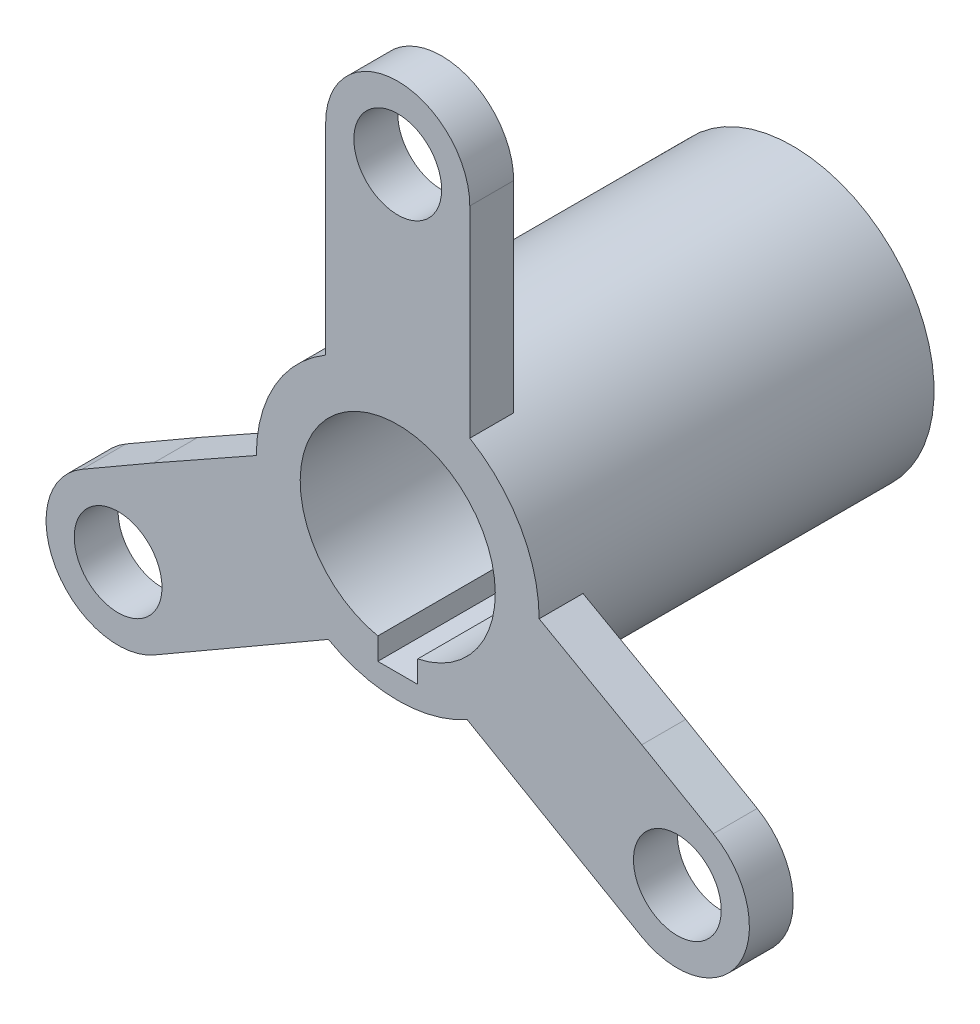
ISO-10303-21;
HEADER;
FILE_DESCRIPTION(('STEP AP214'),'2;1');
FILE_NAME('part.step','',(''),(''),'','','');
FILE_SCHEMA(('AUTOMOTIVE_DESIGN { 1 0 10303 214 1 1 1 1 }'));
ENDSEC;
DATA;
#1=APPLICATION_CONTEXT('core data for automotive mechanical design processes');
#2=APPLICATION_PROTOCOL_DEFINITION('international standard','automotive_design',2000,#1);
#3=PRODUCT_CONTEXT('',#1,'mechanical');
#4=PRODUCT('Part','Part','',(#3));
#5=PRODUCT_RELATED_PRODUCT_CATEGORY('part','',(#4));
#6=PRODUCT_DEFINITION_FORMATION('','',#4);
#7=PRODUCT_DEFINITION_CONTEXT('part definition',#1,'design');
#8=PRODUCT_DEFINITION('design','',#6,#7);
#9=PRODUCT_DEFINITION_SHAPE('','',#8);
#10=(LENGTH_UNIT() NAMED_UNIT(*) SI_UNIT(.MILLI.,.METRE.));
#11=(NAMED_UNIT(*) PLANE_ANGLE_UNIT() SI_UNIT($,.RADIAN.));
#12=(NAMED_UNIT(*) SI_UNIT($,.STERADIAN.) SOLID_ANGLE_UNIT());
#13=UNCERTAINTY_MEASURE_WITH_UNIT(LENGTH_MEASURE(1.E-05),#10,'distance_accuracy_value','');
#14=(GEOMETRIC_REPRESENTATION_CONTEXT(3) GLOBAL_UNCERTAINTY_ASSIGNED_CONTEXT((#13)) GLOBAL_UNIT_ASSIGNED_CONTEXT((#10,
#11,#12)) REPRESENTATION_CONTEXT('',''));
#15=CARTESIAN_POINT('',(0.,0.,0.));
#16=DIRECTION('',(0.,0.,1.));
#17=DIRECTION('',(1.,0.,0.));
#18=AXIS2_PLACEMENT_3D('',#15,#16,#17);
#19=CARTESIAN_POINT('',(-1.07899800205757E-12,36.7899999999997,0.));
#20=DIRECTION('',(0.,0.,1.));
#21=DIRECTION('',(1.,0.,0.));
#22=AXIS2_PLACEMENT_3D('',#19,#20,#21);
#23=PLANE('',#22);
#24=CARTESIAN_POINT('',(-1.07899800205757E-12,36.7899999999997,0.));
#25=DIRECTION('',(0.,0.,1.));
#26=DIRECTION('',(1.,0.,0.));
#27=AXIS2_PLACEMENT_3D('',#24,#25,#26);
#28=CIRCLE('',#27,5.00000000000113);
#29=CARTESIAN_POINT('',(5.00000000000006,36.7899999999997,0.));
#30=VERTEX_POINT('',#29);
#31=EDGE_CURVE('E273',#30,#30,#28,.T.);
#32=ORIENTED_EDGE('',*,*,#31,.T.);
#33=EDGE_LOOP('',(#32));
#34=FACE_BOUND('',#33,.T.);
#35=DIRECTION('',(0.,1.,0.));
#36=VECTOR('',#35,1.);
#37=CARTESIAN_POINT('',(8.20999999999905,36.7899999999997,0.));
#38=LINE('',#37,#36);
#39=CARTESIAN_POINT('',(8.20999999999904,13.8668354356723,0.));
#40=VERTEX_POINT('',#39);
#41=CARTESIAN_POINT('',(8.20999999999905,36.7899999999997,0.));
#42=VERTEX_POINT('',#41);
#43=EDGE_CURVE('E289',#40,#42,#38,.T.);
#44=ORIENTED_EDGE('',*,*,#43,.F.);
#45=CARTESIAN_POINT('',(0.,0.,0.));
#46=DIRECTION('',(0.,0.,1.));
#47=DIRECTION('',(1.,0.,0.));
#48=AXIS2_PLACEMENT_3D('',#45,#46,#47);
#49=CIRCLE('',#48,16.115);
#50=CARTESIAN_POINT('',(-8.21000000000114,13.866835435671,0.));
#51=VERTEX_POINT('',#50);
#52=EDGE_CURVE('E204',#51,#40,#49,.F.);
#53=ORIENTED_EDGE('',*,*,#52,.F.);
#54=DIRECTION('',(0.,-1.,0.));
#55=VECTOR('',#54,1.);
#56=CARTESIAN_POINT('',(-8.21000000000114,36.7899999999997,0.));
#57=LINE('',#56,#55);
#58=CARTESIAN_POINT('',(-8.21000000000114,36.7899999999997,0.));
#59=VERTEX_POINT('',#58);
#60=EDGE_CURVE('E55',#59,#51,#57,.T.);
#61=ORIENTED_EDGE('',*,*,#60,.F.);
#62=CARTESIAN_POINT('',(-1.07899800205757E-12,36.7899999999997,0.));
#63=DIRECTION('',(0.,0.,1.));
#64=DIRECTION('',(1.,0.,0.));
#65=AXIS2_PLACEMENT_3D('',#62,#63,#64);
#66=CIRCLE('',#65,8.21000000000009);
#67=EDGE_CURVE('E284',#42,#59,#66,.T.);
#68=ORIENTED_EDGE('',*,*,#67,.F.);
#69=EDGE_LOOP('',(#44,#53,#61,#68));
#70=FACE_BOUND('',#69,.T.);
#71=ADVANCED_FACE('F32',(#34,#70),#23,.F.);
#72=CARTESIAN_POINT('',(-31.8610746052286,-18.3950000000008,0.));
#73=DIRECTION('',(0.,0.,1.));
#74=DIRECTION('',(1.,0.,0.));
#75=AXIS2_PLACEMENT_3D('',#72,#73,#74);
#76=CIRCLE('',#75,5.00000000000149);
#77=CARTESIAN_POINT('',(-26.8610746052271,-18.3950000000008,0.));
#78=VERTEX_POINT('',#77);
#79=EDGE_CURVE('E263',#78,#78,#76,.T.);
#80=ORIENTED_EDGE('',*,*,#79,.T.);
#81=EDGE_LOOP('',(#80));
#82=FACE_BOUND('',#81,.T.);
#83=DIRECTION('',(-0.866025403784438,-0.5,0.));
#84=VECTOR('',#83,1.);
#85=CARTESIAN_POINT('',(-35.9660746052287,-11.2849314349304,0.));
#86=LINE('',#85,#84);
#87=CARTESIAN_POINT('',(-27.8127882772727,-6.57762937870492,0.));
#88=VERTEX_POINT('',#87);
#89=CARTESIAN_POINT('',(-35.9660746052287,-11.2849314349304,0.));
#90=VERTEX_POINT('',#89);
#91=EDGE_CURVE('E303',#88,#90,#86,.T.);
#92=ORIENTED_EDGE('',*,*,#91,.F.);
#93=DIRECTION('',(-0.871651195110916,-0.490126712250732,0.));
#94=VECTOR('',#93,1.);
#95=CARTESIAN_POINT('',(-27.8127882772727,-6.57762937870492,0.));
#96=LINE('',#95,#94);
#97=CARTESIAN_POINT('',(-16.115,0.,0.));
#98=VERTEX_POINT('',#97);
#99=EDGE_CURVE('E325',#98,#88,#96,.T.);
#100=ORIENTED_EDGE('',*,*,#99,.F.);
#101=CARTESIAN_POINT('',(-7.90403175738881,-14.0434862829067,0.));
#102=VERTEX_POINT('',#101);
#103=EDGE_CURVE('E40',#102,#98,#49,.F.);
#104=ORIENTED_EDGE('',*,*,#103,.F.);
#105=DIRECTION('',(0.866025403784439,0.5,0.));
#106=VECTOR('',#105,1.);
#107=CARTESIAN_POINT('',(-27.7560746052286,-25.5050685650711,0.));
#108=LINE('',#107,#106);
#109=CARTESIAN_POINT('',(-27.7560746052286,-25.5050685650711,0.));
#110=VERTEX_POINT('',#109);
#111=EDGE_CURVE('E224',#110,#102,#108,.T.);
#112=ORIENTED_EDGE('',*,*,#111,.F.);
#113=CARTESIAN_POINT('',(-31.8610746052286,-18.3950000000008,0.));
#114=DIRECTION('',(0.,0.,1.));
#115=DIRECTION('',(1.,0.,0.));
#116=AXIS2_PLACEMENT_3D('',#113,#114,#115);
#117=CIRCLE('',#116,8.21000000000009);
#118=EDGE_CURVE('E305',#90,#110,#117,.T.);
#119=ORIENTED_EDGE('',*,*,#118,.F.);
#120=EDGE_LOOP('',(#92,#100,#104,#112,#119));
#121=FACE_BOUND('',#120,.T.);
#122=ADVANCED_FACE('F357',(#82,#121),#23,.F.);
#123=CARTESIAN_POINT('',(31.8610746052297,-18.3949999999989,0.));
#124=DIRECTION('',(0.,0.,1.));
#125=DIRECTION('',(1.,0.,0.));
#126=AXIS2_PLACEMENT_3D('',#123,#124,#125);
#127=CIRCLE('',#126,5.00000000000131);
#128=CARTESIAN_POINT('',(36.8610746052311,-18.3949999999989,0.));
#129=VERTEX_POINT('',#128);
#130=EDGE_CURVE('E267',#129,#129,#127,.T.);
#131=ORIENTED_EDGE('',*,*,#130,.T.);
#132=EDGE_LOOP('',(#131));
#133=FACE_BOUND('',#132,.T.);
#134=CARTESIAN_POINT('',(16.115,0.,0.));
#135=VERTEX_POINT('',#134);
#136=CARTESIAN_POINT('',(7.90403175739093,-14.0434862829055,0.));
#137=VERTEX_POINT('',#136);
#138=EDGE_CURVE('E202',#135,#137,#49,.F.);
#139=ORIENTED_EDGE('',*,*,#138,.F.);
#140=DIRECTION('',(-0.871651195110994,0.490126712250593,0.));
#141=VECTOR('',#140,1.);
#142=CARTESIAN_POINT('',(27.8127882772732,-6.57762937870277,0.));
#143=LINE('',#142,#141);
#144=CARTESIAN_POINT('',(27.8127882772732,-6.57762937870277,0.));
#145=VERTEX_POINT('',#144);
#146=EDGE_CURVE('E47',#145,#135,#143,.T.);
#147=ORIENTED_EDGE('',*,*,#146,.F.);
#148=DIRECTION('',(-0.866025403784439,0.5,0.));
#149=VECTOR('',#148,1.);
#150=CARTESIAN_POINT('',(35.9660746052298,-11.2849314349286,0.));
#151=LINE('',#150,#149);
#152=CARTESIAN_POINT('',(35.9660746052298,-11.2849314349286,0.));
#153=VERTEX_POINT('',#152);
#154=EDGE_CURVE('E180',#153,#145,#151,.T.);
#155=ORIENTED_EDGE('',*,*,#154,.F.);
#156=CARTESIAN_POINT('',(31.8610746052297,-18.3949999999989,0.));
#157=DIRECTION('',(0.,0.,1.));
#158=DIRECTION('',(1.,0.,0.));
#159=AXIS2_PLACEMENT_3D('',#156,#157,#158);
#160=CIRCLE('',#159,8.21000000000009);
#161=CARTESIAN_POINT('',(27.7560746052297,-25.5050685650692,0.));
#162=VERTEX_POINT('',#161);
#163=EDGE_CURVE('E221',#162,#153,#160,.T.);
#164=ORIENTED_EDGE('',*,*,#163,.F.);
#165=DIRECTION('',(0.866025403784438,-0.5,0.));
#166=VECTOR('',#165,1.);
#167=CARTESIAN_POINT('',(27.7560746052297,-25.5050685650692,0.));
#168=LINE('',#167,#166);
#169=EDGE_CURVE('E219',#137,#162,#168,.T.);
#170=ORIENTED_EDGE('',*,*,#169,.F.);
#171=EDGE_LOOP('',(#139,#147,#155,#164,#170));
#172=FACE_BOUND('',#171,.T.);
#173=ADVANCED_FACE('F220',(#133,#172),#23,.F.);
#174=CARTESIAN_POINT('',(-1.07899800205757E-12,36.7899999999997,5.));
#175=DIRECTION('',(0.,0.,1.));
#176=DIRECTION('',(1.,0.,0.));
#177=AXIS2_PLACEMENT_3D('',#174,#175,#176);
#178=PLANE('',#177);
#179=CARTESIAN_POINT('',(0.,0.,5.));
#180=DIRECTION('',(0.,0.,1.));
#181=DIRECTION('',(-1.,0.,0.));
#182=AXIS2_PLACEMENT_3D('',#179,#180,#181);
#183=CIRCLE('',#182,16.115);
#184=CARTESIAN_POINT('',(16.115,0.,5.));
#185=VERTEX_POINT('',#184);
#186=CARTESIAN_POINT('',(8.20999999999904,13.8668354356723,5.));
#187=VERTEX_POINT('',#186);
#188=EDGE_CURVE('E164',#185,#187,#183,.T.);
#189=ORIENTED_EDGE('',*,*,#188,.T.);
#190=DIRECTION('',(0.,1.,0.));
#191=VECTOR('',#190,1.);
#192=CARTESIAN_POINT('',(8.20999999999905,36.7899999999997,5.));
#193=LINE('',#192,#191);
#194=CARTESIAN_POINT('',(8.20999999999905,36.7899999999997,5.));
#195=VERTEX_POINT('',#194);
#196=EDGE_CURVE('E175',#187,#195,#193,.T.);
#197=ORIENTED_EDGE('',*,*,#196,.T.);
#198=CARTESIAN_POINT('',(-1.07899800205757E-12,36.7899999999997,5.));
#199=DIRECTION('',(0.,0.,1.));
#200=DIRECTION('',(1.,0.,0.));
#201=AXIS2_PLACEMENT_3D('',#198,#199,#200);
#202=CIRCLE('',#201,8.21000000000009);
#203=CARTESIAN_POINT('',(-8.21000000000114,36.7899999999997,5.));
#204=VERTEX_POINT('',#203);
#205=EDGE_CURVE('E285',#195,#204,#202,.T.);
#206=ORIENTED_EDGE('',*,*,#205,.T.);
#207=DIRECTION('',(0.,-1.,0.));
#208=VECTOR('',#207,1.);
#209=CARTESIAN_POINT('',(-8.21000000000114,36.7899999999997,5.));
#210=LINE('',#209,#208);
#211=CARTESIAN_POINT('',(-8.21000000000114,13.866835435671,5.));
#212=VERTEX_POINT('',#211);
#213=EDGE_CURVE('E288',#204,#212,#210,.T.);
#214=ORIENTED_EDGE('',*,*,#213,.T.);
#215=CARTESIAN_POINT('',(0.,0.,5.));
#216=DIRECTION('',(0.,0.,1.));
#217=DIRECTION('',(-1.,0.,0.));
#218=AXIS2_PLACEMENT_3D('',#215,#216,#217);
#219=CIRCLE('',#218,16.115);
#220=CARTESIAN_POINT('',(-16.115,0.,5.));
#221=VERTEX_POINT('',#220);
#222=EDGE_CURVE('E327',#212,#221,#219,.T.);
#223=ORIENTED_EDGE('',*,*,#222,.T.);
#224=DIRECTION('',(-0.871651195110916,-0.490126712250732,0.));
#225=VECTOR('',#224,1.);
#226=CARTESIAN_POINT('',(-27.8127882772727,-6.57762937870492,5.));
#227=LINE('',#226,#225);
#228=CARTESIAN_POINT('',(-27.8127882772727,-6.57762937870492,5.));
#229=VERTEX_POINT('',#228);
#230=EDGE_CURVE('E334',#221,#229,#227,.T.);
#231=ORIENTED_EDGE('',*,*,#230,.T.);
#232=DIRECTION('',(-0.866025403784438,-0.5,0.));
#233=VECTOR('',#232,1.);
#234=CARTESIAN_POINT('',(-35.9660746052287,-11.2849314349304,5.));
#235=LINE('',#234,#233);
#236=CARTESIAN_POINT('',(-35.9660746052287,-11.2849314349304,5.));
#237=VERTEX_POINT('',#236);
#238=EDGE_CURVE('E291',#229,#237,#235,.T.);
#239=ORIENTED_EDGE('',*,*,#238,.T.);
#240=CARTESIAN_POINT('',(-31.8610746052286,-18.3950000000008,5.));
#241=DIRECTION('',(0.,0.,1.));
#242=DIRECTION('',(1.,0.,0.));
#243=AXIS2_PLACEMENT_3D('',#240,#241,#242);
#244=CIRCLE('',#243,8.21000000000009);
#245=CARTESIAN_POINT('',(-27.7560746052286,-25.5050685650711,5.));
#246=VERTEX_POINT('',#245);
#247=EDGE_CURVE('E293',#237,#246,#244,.T.);
#248=ORIENTED_EDGE('',*,*,#247,.T.);
#249=DIRECTION('',(0.866025403784439,0.5,0.));
#250=VECTOR('',#249,1.);
#251=CARTESIAN_POINT('',(-27.7560746052286,-25.5050685650711,5.));
#252=LINE('',#251,#250);
#253=CARTESIAN_POINT('',(-7.9040317573888,-14.0434862829067,5.));
#254=VERTEX_POINT('',#253);
#255=EDGE_CURVE('E295',#246,#254,#252,.T.);
#256=ORIENTED_EDGE('',*,*,#255,.T.);
#257=CARTESIAN_POINT('',(0.,0.,5.));
#258=DIRECTION('',(0.,0.,1.));
#259=DIRECTION('',(-1.,0.,0.));
#260=AXIS2_PLACEMENT_3D('',#257,#258,#259);
#261=CIRCLE('',#260,16.115);
#262=CARTESIAN_POINT('',(7.90403175739093,-14.0434862829055,5.));
#263=VERTEX_POINT('',#262);
#264=EDGE_CURVE('E233',#254,#263,#261,.T.);
#265=ORIENTED_EDGE('',*,*,#264,.T.);
#266=DIRECTION('',(0.866025403784438,-0.5,0.));
#267=VECTOR('',#266,1.);
#268=CARTESIAN_POINT('',(27.7560746052297,-25.5050685650692,5.));
#269=LINE('',#268,#267);
#270=CARTESIAN_POINT('',(27.7560746052297,-25.5050685650692,5.));
#271=VERTEX_POINT('',#270);
#272=EDGE_CURVE('E227',#263,#271,#269,.T.);
#273=ORIENTED_EDGE('',*,*,#272,.T.);
#274=CARTESIAN_POINT('',(31.8610746052297,-18.3949999999989,5.));
#275=DIRECTION('',(0.,0.,1.));
#276=DIRECTION('',(1.,0.,0.));
#277=AXIS2_PLACEMENT_3D('',#274,#275,#276);
#278=CIRCLE('',#277,8.21000000000009);
#279=CARTESIAN_POINT('',(35.9660746052298,-11.2849314349286,5.));
#280=VERTEX_POINT('',#279);
#281=EDGE_CURVE('E171',#271,#280,#278,.T.);
#282=ORIENTED_EDGE('',*,*,#281,.T.);
#283=DIRECTION('',(-0.866025403784439,0.5,0.));
#284=VECTOR('',#283,1.);
#285=CARTESIAN_POINT('',(35.9660746052298,-11.2849314349286,5.));
#286=LINE('',#285,#284);
#287=CARTESIAN_POINT('',(27.8127882772732,-6.57762937870277,5.));
#288=VERTEX_POINT('',#287);
#289=EDGE_CURVE('E167',#280,#288,#286,.T.);
#290=ORIENTED_EDGE('',*,*,#289,.T.);
#291=DIRECTION('',(-0.871651195110994,0.490126712250593,0.));
#292=VECTOR('',#291,1.);
#293=CARTESIAN_POINT('',(27.8127882772732,-6.57762937870277,5.));
#294=LINE('',#293,#292);
#295=EDGE_CURVE('E155',#288,#185,#294,.T.);
#296=ORIENTED_EDGE('',*,*,#295,.T.);
#297=EDGE_LOOP('',(#189,#197,#206,#214,#223,#231,#239,#248,#256,#265,#273,#282,#290,#296));
#298=FACE_BOUND('',#297,.T.);
#299=DIRECTION('',(0.,1.,0.));
#300=VECTOR('',#299,1.);
#301=CARTESIAN_POINT('',(2.27,-10.8807318228141,5.));
#302=LINE('',#301,#300);
#303=CARTESIAN_POINT('',(2.27,-13.39,5.));
#304=VERTEX_POINT('',#303);
#305=CARTESIAN_POINT('',(2.27,-10.8807318228141,5.));
#306=VERTEX_POINT('',#305);
#307=EDGE_CURVE('E242',#304,#306,#302,.T.);
#308=ORIENTED_EDGE('',*,*,#307,.F.);
#309=DIRECTION('',(1.,0.,0.));
#310=VECTOR('',#309,1.);
#311=CARTESIAN_POINT('',(-2.27,-13.39,5.));
#312=LINE('',#311,#310);
#313=CARTESIAN_POINT('',(-2.27,-13.39,5.));
#314=VERTEX_POINT('',#313);
#315=EDGE_CURVE('E231',#314,#304,#312,.T.);
#316=ORIENTED_EDGE('',*,*,#315,.F.);
#317=DIRECTION('',(0.,-1.,0.));
#318=VECTOR('',#317,1.);
#319=CARTESIAN_POINT('',(-2.27,-13.39,5.));
#320=LINE('',#319,#318);
#321=CARTESIAN_POINT('',(-2.27,-10.8807318228141,5.));
#322=VERTEX_POINT('',#321);
#323=EDGE_CURVE('E228',#322,#314,#320,.T.);
#324=ORIENTED_EDGE('',*,*,#323,.F.);
#325=CARTESIAN_POINT('',(0.,0.,5.));
#326=DIRECTION('',(0.,0.,1.));
#327=DIRECTION('',(1.,0.,0.));
#328=AXIS2_PLACEMENT_3D('',#325,#326,#327);
#329=CIRCLE('',#328,11.115);
#330=EDGE_CURVE('E279',#306,#322,#329,.T.);
#331=ORIENTED_EDGE('',*,*,#330,.F.);
#332=EDGE_LOOP('',(#308,#316,#324,#331));
#333=FACE_BOUND('',#332,.T.);
#334=CARTESIAN_POINT('',(31.8610746052297,-18.3949999999989,5.));
#335=DIRECTION('',(0.,0.,1.));
#336=DIRECTION('',(1.,0.,0.));
#337=AXIS2_PLACEMENT_3D('',#334,#335,#336);
#338=CIRCLE('',#337,5.00000000000131);
#339=CARTESIAN_POINT('',(36.8610746052311,-18.3949999999989,5.));
#340=VERTEX_POINT('',#339);
#341=EDGE_CURVE('E270',#340,#340,#338,.T.);
#342=ORIENTED_EDGE('',*,*,#341,.F.);
#343=EDGE_LOOP('',(#342));
#344=FACE_BOUND('',#343,.T.);
#345=CARTESIAN_POINT('',(-1.07899800205757E-12,36.7899999999997,5.));
#346=DIRECTION('',(0.,0.,1.));
#347=DIRECTION('',(1.,0.,0.));
#348=AXIS2_PLACEMENT_3D('',#345,#346,#347);
#349=CIRCLE('',#348,5.00000000000113);
#350=CARTESIAN_POINT('',(5.00000000000006,36.7899999999997,5.));
#351=VERTEX_POINT('',#350);
#352=EDGE_CURVE('E276',#351,#351,#349,.T.);
#353=ORIENTED_EDGE('',*,*,#352,.F.);
#354=EDGE_LOOP('',(#353));
#355=FACE_BOUND('',#354,.T.);
#356=CARTESIAN_POINT('',(-31.8610746052286,-18.3950000000008,5.));
#357=DIRECTION('',(0.,0.,1.));
#358=DIRECTION('',(1.,0.,0.));
#359=AXIS2_PLACEMENT_3D('',#356,#357,#358);
#360=CIRCLE('',#359,5.00000000000149);
#361=CARTESIAN_POINT('',(-26.8610746052271,-18.3950000000008,5.));
#362=VERTEX_POINT('',#361);
#363=EDGE_CURVE('E264',#362,#362,#360,.T.);
#364=ORIENTED_EDGE('',*,*,#363,.F.);
#365=EDGE_LOOP('',(#364));
#366=FACE_BOUND('',#365,.T.);
#367=ADVANCED_FACE('F168',(#298,#333,#344,#355,#366),#178,.T.);
#368=CARTESIAN_POINT('',(-1.07899800205757E-12,36.7899999999997,5.));
#369=DIRECTION('',(0.,0.,-1.));
#370=DIRECTION('',(-1.,0.,0.));
#371=AXIS2_PLACEMENT_3D('',#368,#369,#370);
#372=CYLINDRICAL_SURFACE('',#371,8.21000000000009);
#373=ORIENTED_EDGE('',*,*,#67,.T.);
#374=DIRECTION('',(0.,0.,-1.));
#375=VECTOR('',#374,1.);
#376=CARTESIAN_POINT('',(-8.21000000000114,36.7899999999997,5.));
#377=LINE('',#376,#375);
#378=EDGE_CURVE('E201',#204,#59,#377,.T.);
#379=ORIENTED_EDGE('',*,*,#378,.F.);
#380=ORIENTED_EDGE('',*,*,#205,.F.);
#381=DIRECTION('',(0.,0.,-1.));
#382=VECTOR('',#381,1.);
#383=CARTESIAN_POINT('',(8.20999999999905,36.7899999999997,5.));
#384=LINE('',#383,#382);
#385=EDGE_CURVE('E182',#195,#42,#384,.T.);
#386=ORIENTED_EDGE('',*,*,#385,.T.);
#387=EDGE_LOOP('',(#373,#379,#380,#386));
#388=FACE_BOUND('',#387,.T.);
#389=ADVANCED_FACE('F34',(#388),#372,.T.);
#390=CARTESIAN_POINT('',(-8.21000000000114,36.7899999999997,5.));
#391=DIRECTION('',(1.,0.,0.));
#392=DIRECTION('',(0.,1.,0.));
#393=AXIS2_PLACEMENT_3D('',#390,#391,#392);
#394=PLANE('',#393);
#395=ORIENTED_EDGE('',*,*,#60,.T.);
#396=DIRECTION('',(0.,0.,-1.));
#397=VECTOR('',#396,1.);
#398=CARTESIAN_POINT('',(-8.21000000000114,13.866835435671,5.));
#399=LINE('',#398,#397);
#400=EDGE_CURVE('E322',#212,#51,#399,.T.);
#401=ORIENTED_EDGE('',*,*,#400,.F.);
#402=ORIENTED_EDGE('',*,*,#213,.F.);
#403=ORIENTED_EDGE('',*,*,#378,.T.);
#404=EDGE_LOOP('',(#395,#401,#402,#403));
#405=FACE_BOUND('',#404,.T.);
#406=ADVANCED_FACE('F321',(#405),#394,.F.);
#407=CARTESIAN_POINT('',(-35.9660746052287,-11.2849314349304,5.));
#408=DIRECTION('',(0.5,-0.866025403784438,0.));
#409=DIRECTION('',(0.866025403784439,0.5,0.));
#410=AXIS2_PLACEMENT_3D('',#407,#408,#409);
#411=PLANE('',#410);
#412=ORIENTED_EDGE('',*,*,#91,.T.);
#413=DIRECTION('',(0.,0.,-1.));
#414=VECTOR('',#413,1.);
#415=CARTESIAN_POINT('',(-35.9660746052287,-11.2849314349304,5.));
#416=LINE('',#415,#414);
#417=EDGE_CURVE('E195',#237,#90,#416,.T.);
#418=ORIENTED_EDGE('',*,*,#417,.F.);
#419=ORIENTED_EDGE('',*,*,#238,.F.);
#420=DIRECTION('',(0.,0.,-1.));
#421=VECTOR('',#420,1.);
#422=CARTESIAN_POINT('',(-27.8127882772727,-6.57762937870492,5.));
#423=LINE('',#422,#421);
#424=EDGE_CURVE('E198',#229,#88,#423,.T.);
#425=ORIENTED_EDGE('',*,*,#424,.T.);
#426=EDGE_LOOP('',(#412,#418,#419,#425));
#427=FACE_BOUND('',#426,.T.);
#428=ADVANCED_FACE('F343',(#427),#411,.F.);
#429=CARTESIAN_POINT('',(-31.8610746052286,-18.3950000000008,5.));
#430=DIRECTION('',(0.,0.,-1.));
#431=DIRECTION('',(-1.,0.,0.));
#432=AXIS2_PLACEMENT_3D('',#429,#430,#431);
#433=CYLINDRICAL_SURFACE('',#432,8.21000000000009);
#434=ORIENTED_EDGE('',*,*,#118,.T.);
#435=DIRECTION('',(0.,0.,-1.));
#436=VECTOR('',#435,1.);
#437=CARTESIAN_POINT('',(-27.7560746052286,-25.5050685650711,5.));
#438=LINE('',#437,#436);
#439=EDGE_CURVE('E192',#246,#110,#438,.T.);
#440=ORIENTED_EDGE('',*,*,#439,.F.);
#441=ORIENTED_EDGE('',*,*,#247,.F.);
#442=ORIENTED_EDGE('',*,*,#417,.T.);
#443=EDGE_LOOP('',(#434,#440,#441,#442));
#444=FACE_BOUND('',#443,.T.);
#445=ADVANCED_FACE('F349',(#444),#433,.T.);
#446=CARTESIAN_POINT('',(-27.7560746052286,-25.5050685650711,5.));
#447=DIRECTION('',(-0.5,0.866025403784439,0.));
#448=DIRECTION('',(-0.866025403784439,-0.5,0.));
#449=AXIS2_PLACEMENT_3D('',#446,#447,#448);
#450=PLANE('',#449);
#451=ORIENTED_EDGE('',*,*,#111,.T.);
#452=DIRECTION('',(0.,0.,-1.));
#453=VECTOR('',#452,1.);
#454=CARTESIAN_POINT('',(-7.9040317573888,-14.0434862829067,5.));
#455=LINE('',#454,#453);
#456=EDGE_CURVE('E229',#254,#102,#455,.T.);
#457=ORIENTED_EDGE('',*,*,#456,.F.);
#458=ORIENTED_EDGE('',*,*,#255,.F.);
#459=ORIENTED_EDGE('',*,*,#439,.T.);
#460=EDGE_LOOP('',(#451,#457,#458,#459));
#461=FACE_BOUND('',#460,.T.);
#462=ADVANCED_FACE('F353',(#461),#450,.F.);
#463=CARTESIAN_POINT('',(27.7560746052297,-25.5050685650692,5.));
#464=DIRECTION('',(0.5,0.866025403784438,0.));
#465=DIRECTION('',(-0.866025403784438,0.500000000000001,0.));
#466=AXIS2_PLACEMENT_3D('',#463,#464,#465);
#467=PLANE('',#466);
#468=ORIENTED_EDGE('',*,*,#169,.T.);
#469=DIRECTION('',(0.,0.,-1.));
#470=VECTOR('',#469,1.);
#471=CARTESIAN_POINT('',(27.7560746052297,-25.5050685650692,5.));
#472=LINE('',#471,#470);
#473=EDGE_CURVE('E184',#271,#162,#472,.T.);
#474=ORIENTED_EDGE('',*,*,#473,.F.);
#475=ORIENTED_EDGE('',*,*,#272,.F.);
#476=DIRECTION('',(0.,0.,-1.));
#477=VECTOR('',#476,1.);
#478=CARTESIAN_POINT('',(7.90403175739093,-14.0434862829055,5.));
#479=LINE('',#478,#477);
#480=EDGE_CURVE('E215',#263,#137,#479,.T.);
#481=ORIENTED_EDGE('',*,*,#480,.T.);
#482=EDGE_LOOP('',(#468,#474,#475,#481));
#483=FACE_BOUND('',#482,.T.);
#484=ADVANCED_FACE('F226',(#483),#467,.F.);
#485=CARTESIAN_POINT('',(31.8610746052297,-18.3949999999989,5.));
#486=DIRECTION('',(0.,0.,-1.));
#487=DIRECTION('',(-1.,0.,0.));
#488=AXIS2_PLACEMENT_3D('',#485,#486,#487);
#489=CYLINDRICAL_SURFACE('',#488,8.21000000000009);
#490=ORIENTED_EDGE('',*,*,#163,.T.);
#491=DIRECTION('',(0.,0.,-1.));
#492=VECTOR('',#491,1.);
#493=CARTESIAN_POINT('',(35.9660746052298,-11.2849314349286,5.));
#494=LINE('',#493,#492);
#495=EDGE_CURVE('E181',#280,#153,#494,.T.);
#496=ORIENTED_EDGE('',*,*,#495,.F.);
#497=ORIENTED_EDGE('',*,*,#281,.F.);
#498=ORIENTED_EDGE('',*,*,#473,.T.);
#499=EDGE_LOOP('',(#490,#496,#497,#498));
#500=FACE_BOUND('',#499,.T.);
#501=ADVANCED_FACE('F472',(#500),#489,.T.);
#502=CARTESIAN_POINT('',(35.9660746052298,-11.2849314349286,5.));
#503=DIRECTION('',(-0.5,-0.866025403784439,0.));
#504=DIRECTION('',(0.866025403784439,-0.5,0.));
#505=AXIS2_PLACEMENT_3D('',#502,#503,#504);
#506=PLANE('',#505);
#507=ORIENTED_EDGE('',*,*,#154,.T.);
#508=DIRECTION('',(0.,0.,-1.));
#509=VECTOR('',#508,1.);
#510=CARTESIAN_POINT('',(27.8127882772732,-6.57762937870277,5.));
#511=LINE('',#510,#509);
#512=EDGE_CURVE('E159',#288,#145,#511,.T.);
#513=ORIENTED_EDGE('',*,*,#512,.F.);
#514=ORIENTED_EDGE('',*,*,#289,.F.);
#515=ORIENTED_EDGE('',*,*,#495,.T.);
#516=EDGE_LOOP('',(#507,#513,#514,#515));
#517=FACE_BOUND('',#516,.T.);
#518=ADVANCED_FACE('F178',(#517),#506,.F.);
#519=CARTESIAN_POINT('',(8.20999999999905,36.7899999999997,5.));
#520=DIRECTION('',(-1.,0.,0.));
#521=DIRECTION('',(0.,-1.,0.));
#522=AXIS2_PLACEMENT_3D('',#519,#520,#521);
#523=PLANE('',#522);
#524=ORIENTED_EDGE('',*,*,#43,.T.);
#525=ORIENTED_EDGE('',*,*,#385,.F.);
#526=ORIENTED_EDGE('',*,*,#196,.F.);
#527=DIRECTION('',(0.,0.,-1.));
#528=VECTOR('',#527,1.);
#529=CARTESIAN_POINT('',(8.20999999999904,13.8668354356723,5.));
#530=LINE('',#529,#528);
#531=EDGE_CURVE('E315',#187,#40,#530,.T.);
#532=ORIENTED_EDGE('',*,*,#531,.T.);
#533=EDGE_LOOP('',(#524,#525,#526,#532));
#534=FACE_BOUND('',#533,.T.);
#535=ADVANCED_FACE('F312',(#534),#523,.F.);
#536=CARTESIAN_POINT('',(0.,0.,5.));
#537=DIRECTION('',(0.,0.,-1.));
#538=DIRECTION('',(-1.,0.,0.));
#539=AXIS2_PLACEMENT_3D('',#536,#537,#538);
#540=CYLINDRICAL_SURFACE('',#539,11.115);
#541=DIRECTION('',(0.,0.,-1.));
#542=VECTOR('',#541,1.);
#543=CARTESIAN_POINT('',(2.27,-10.8807318228141,5.));
#544=LINE('',#543,#542);
#545=CARTESIAN_POINT('',(2.27,-10.8807318228141,-40.));
#546=VERTEX_POINT('',#545);
#547=EDGE_CURVE('E255',#306,#546,#544,.T.);
#548=ORIENTED_EDGE('',*,*,#547,.F.);
#549=ORIENTED_EDGE('',*,*,#330,.T.);
#550=DIRECTION('',(0.,0.,-1.));
#551=VECTOR('',#550,1.);
#552=CARTESIAN_POINT('',(-2.27,-10.8807318228141,5.));
#553=LINE('',#552,#551);
#554=CARTESIAN_POINT('',(-2.27,-10.8807318228141,-40.));
#555=VERTEX_POINT('',#554);
#556=EDGE_CURVE('E251',#555,#322,#553,.F.);
#557=ORIENTED_EDGE('',*,*,#556,.F.);
#558=CARTESIAN_POINT('',(0.,0.,-40.));
#559=DIRECTION('',(0.,0.,-1.));
#560=DIRECTION('',(-1.,0.,0.));
#561=AXIS2_PLACEMENT_3D('',#558,#559,#560);
#562=CIRCLE('',#561,11.115);
#563=EDGE_CURVE('E257',#555,#546,#562,.T.);
#564=ORIENTED_EDGE('',*,*,#563,.T.);
#565=EDGE_LOOP('',(#548,#549,#557,#564));
#566=FACE_BOUND('',#565,.T.);
#567=ADVANCED_FACE('F400',(#566),#540,.F.);
#568=CARTESIAN_POINT('',(-1.07899800205757E-12,36.7899999999997,5.));
#569=DIRECTION('',(0.,0.,-1.));
#570=DIRECTION('',(-1.,0.,0.));
#571=AXIS2_PLACEMENT_3D('',#568,#569,#570);
#572=CYLINDRICAL_SURFACE('',#571,5.00000000000113);
#573=ORIENTED_EDGE('',*,*,#352,.T.);
#574=EDGE_LOOP('',(#573));
#575=FACE_BOUND('',#574,.T.);
#576=ORIENTED_EDGE('',*,*,#31,.F.);
#577=EDGE_LOOP('',(#576));
#578=FACE_BOUND('',#577,.T.);
#579=ADVANCED_FACE('F390',(#575,#578),#572,.F.);
#580=CARTESIAN_POINT('',(31.8610746052297,-18.3949999999989,5.));
#581=DIRECTION('',(0.,0.,-1.));
#582=DIRECTION('',(-1.,0.,0.));
#583=AXIS2_PLACEMENT_3D('',#580,#581,#582);
#584=CYLINDRICAL_SURFACE('',#583,5.00000000000131);
#585=ORIENTED_EDGE('',*,*,#341,.T.);
#586=EDGE_LOOP('',(#585));
#587=FACE_BOUND('',#586,.T.);
#588=ORIENTED_EDGE('',*,*,#130,.F.);
#589=EDGE_LOOP('',(#588));
#590=FACE_BOUND('',#589,.T.);
#591=ADVANCED_FACE('F387',(#587,#590),#584,.F.);
#592=CARTESIAN_POINT('',(-31.8610746052286,-18.3950000000008,5.));
#593=DIRECTION('',(0.,0.,-1.));
#594=DIRECTION('',(-1.,0.,0.));
#595=AXIS2_PLACEMENT_3D('',#592,#593,#594);
#596=CYLINDRICAL_SURFACE('',#595,5.00000000000149);
#597=ORIENTED_EDGE('',*,*,#363,.T.);
#598=EDGE_LOOP('',(#597));
#599=FACE_BOUND('',#598,.T.);
#600=ORIENTED_EDGE('',*,*,#79,.F.);
#601=EDGE_LOOP('',(#600));
#602=FACE_BOUND('',#601,.T.);
#603=ADVANCED_FACE('F389',(#599,#602),#596,.F.);
#604=CARTESIAN_POINT('',(0.,0.,-40.));
#605=DIRECTION('',(0.,0.,-1.));
#606=DIRECTION('',(-1.,0.,0.));
#607=AXIS2_PLACEMENT_3D('',#604,#605,#606);
#608=PLANE('',#607);
#609=DIRECTION('',(0.,1.,0.));
#610=VECTOR('',#609,1.);
#611=CARTESIAN_POINT('',(2.27,-13.39,-40.));
#612=LINE('',#611,#610);
#613=CARTESIAN_POINT('',(2.27,-13.39,-40.));
#614=VERTEX_POINT('',#613);
#615=EDGE_CURVE('E241',#614,#546,#612,.T.);
#616=ORIENTED_EDGE('',*,*,#615,.T.);
#617=ORIENTED_EDGE('',*,*,#563,.F.);
#618=DIRECTION('',(0.,1.,0.));
#619=VECTOR('',#618,1.);
#620=CARTESIAN_POINT('',(-2.27,0.,-40.));
#621=LINE('',#620,#619);
#622=CARTESIAN_POINT('',(-2.27,-13.39,-40.));
#623=VERTEX_POINT('',#622);
#624=EDGE_CURVE('E11',#623,#555,#621,.T.);
#625=ORIENTED_EDGE('',*,*,#624,.F.);
#626=DIRECTION('',(1.,0.,0.));
#627=VECTOR('',#626,1.);
#628=CARTESIAN_POINT('',(-2.27,-13.39,-40.));
#629=LINE('',#628,#627);
#630=EDGE_CURVE('E238',#623,#614,#629,.T.);
#631=ORIENTED_EDGE('',*,*,#630,.T.);
#632=EDGE_LOOP('',(#616,#617,#625,#631));
#633=FACE_BOUND('',#632,.T.);
#634=CARTESIAN_POINT('',(0.,0.,-40.));
#635=DIRECTION('',(0.,0.,-1.));
#636=DIRECTION('',(-1.,0.,0.));
#637=AXIS2_PLACEMENT_3D('',#634,#635,#636);
#638=CIRCLE('',#637,16.115);
#639=CARTESIAN_POINT('',(-16.115,0.,-40.));
#640=VERTEX_POINT('',#639);
#641=EDGE_CURVE('E260',#640,#640,#638,.T.);
#642=ORIENTED_EDGE('',*,*,#641,.T.);
#643=EDGE_LOOP('',(#642));
#644=FACE_BOUND('',#643,.T.);
#645=ADVANCED_FACE('F397',(#633,#644),#608,.T.);
#646=CARTESIAN_POINT('',(0.,0.,-40.));
#647=DIRECTION('',(0.,0.,1.));
#648=DIRECTION('',(1.,0.,0.));
#649=AXIS2_PLACEMENT_3D('',#646,#647,#648);
#650=CYLINDRICAL_SURFACE('',#649,16.115);
#651=ORIENTED_EDGE('',*,*,#641,.F.);
#652=EDGE_LOOP('',(#651));
#653=FACE_BOUND('',#652,.T.);
#654=ORIENTED_EDGE('',*,*,#103,.T.);
#655=DIRECTION('',(0.,0.,-1.));
#656=VECTOR('',#655,1.);
#657=CARTESIAN_POINT('',(-16.115,0.,5.));
#658=LINE('',#657,#656);
#659=EDGE_CURVE('E337',#221,#98,#658,.T.);
#660=ORIENTED_EDGE('',*,*,#659,.F.);
#661=ORIENTED_EDGE('',*,*,#222,.F.);
#662=ORIENTED_EDGE('',*,*,#400,.T.);
#663=ORIENTED_EDGE('',*,*,#52,.T.);
#664=ORIENTED_EDGE('',*,*,#531,.F.);
#665=ORIENTED_EDGE('',*,*,#188,.F.);
#666=DIRECTION('',(0.,0.,-1.));
#667=VECTOR('',#666,1.);
#668=CARTESIAN_POINT('',(16.115,0.,5.));
#669=LINE('',#668,#667);
#670=EDGE_CURVE('E160',#185,#135,#669,.T.);
#671=ORIENTED_EDGE('',*,*,#670,.T.);
#672=ORIENTED_EDGE('',*,*,#138,.T.);
#673=ORIENTED_EDGE('',*,*,#480,.F.);
#674=ORIENTED_EDGE('',*,*,#264,.F.);
#675=ORIENTED_EDGE('',*,*,#456,.T.);
#676=EDGE_LOOP('',(#654,#660,#661,#662,#663,#664,#665,#671,#672,#673,#674,#675));
#677=FACE_BOUND('',#676,.T.);
#678=ADVANCED_FACE('F212',(#653,#677),#650,.T.);
#679=CARTESIAN_POINT('',(2.27,-10.8807318228141,-40.));
#680=DIRECTION('',(1.,0.,0.));
#681=DIRECTION('',(0.,0.,-1.));
#682=AXIS2_PLACEMENT_3D('',#679,#680,#681);
#683=PLANE('',#682);
#684=ORIENTED_EDGE('',*,*,#547,.T.);
#685=ORIENTED_EDGE('',*,*,#615,.F.);
#686=DIRECTION('',(0.,0.,1.));
#687=VECTOR('',#686,1.);
#688=CARTESIAN_POINT('',(2.27,-13.39,-40.));
#689=LINE('',#688,#687);
#690=EDGE_CURVE('E249',#614,#304,#689,.T.);
#691=ORIENTED_EDGE('',*,*,#690,.T.);
#692=ORIENTED_EDGE('',*,*,#307,.T.);
#693=EDGE_LOOP('',(#684,#685,#691,#692));
#694=FACE_BOUND('',#693,.T.);
#695=ADVANCED_FACE('F425',(#694),#683,.F.);
#696=CARTESIAN_POINT('',(-2.27,-13.39,-40.));
#697=DIRECTION('',(0.,-1.,0.));
#698=DIRECTION('',(1.,0.,0.));
#699=AXIS2_PLACEMENT_3D('',#696,#697,#698);
#700=PLANE('',#699);
#701=ORIENTED_EDGE('',*,*,#315,.T.);
#702=ORIENTED_EDGE('',*,*,#690,.F.);
#703=ORIENTED_EDGE('',*,*,#630,.F.);
#704=DIRECTION('',(0.,0.,1.));
#705=VECTOR('',#704,1.);
#706=CARTESIAN_POINT('',(-2.27,-13.39,-40.));
#707=LINE('',#706,#705);
#708=EDGE_CURVE('E244',#623,#314,#707,.T.);
#709=ORIENTED_EDGE('',*,*,#708,.T.);
#710=EDGE_LOOP('',(#701,#702,#703,#709));
#711=FACE_BOUND('',#710,.T.);
#712=ADVANCED_FACE('F367',(#711),#700,.F.);
#713=CARTESIAN_POINT('',(-2.27,-13.39,-40.));
#714=DIRECTION('',(-1.,0.,0.));
#715=DIRECTION('',(0.,-1.,0.));
#716=AXIS2_PLACEMENT_3D('',#713,#714,#715);
#717=PLANE('',#716);
#718=ORIENTED_EDGE('',*,*,#556,.T.);
#719=ORIENTED_EDGE('',*,*,#323,.T.);
#720=ORIENTED_EDGE('',*,*,#708,.F.);
#721=ORIENTED_EDGE('',*,*,#624,.T.);
#722=EDGE_LOOP('',(#718,#719,#720,#721));
#723=FACE_BOUND('',#722,.T.);
#724=ADVANCED_FACE('F360',(#723),#717,.F.);
#725=CARTESIAN_POINT('',(-27.8127882772727,-6.57762937870492,5.));
#726=DIRECTION('',(0.490126712250732,-0.871651195110916,0.));
#727=DIRECTION('',(0.871651195110916,0.490126712250732,0.));
#728=AXIS2_PLACEMENT_3D('',#725,#726,#727);
#729=PLANE('',#728);
#730=ORIENTED_EDGE('',*,*,#99,.T.);
#731=ORIENTED_EDGE('',*,*,#424,.F.);
#732=ORIENTED_EDGE('',*,*,#230,.F.);
#733=ORIENTED_EDGE('',*,*,#659,.T.);
#734=EDGE_LOOP('',(#730,#731,#732,#733));
#735=FACE_BOUND('',#734,.T.);
#736=ADVANCED_FACE('F358',(#735),#729,.F.);
#737=CARTESIAN_POINT('',(27.8127882772732,-6.57762937870277,5.));
#738=DIRECTION('',(-0.490126712250593,-0.871651195110994,0.));
#739=DIRECTION('',(0.871651195110994,-0.490126712250593,0.));
#740=AXIS2_PLACEMENT_3D('',#737,#738,#739);
#741=PLANE('',#740);
#742=ORIENTED_EDGE('',*,*,#146,.T.);
#743=ORIENTED_EDGE('',*,*,#670,.F.);
#744=ORIENTED_EDGE('',*,*,#295,.F.);
#745=ORIENTED_EDGE('',*,*,#512,.T.);
#746=EDGE_LOOP('',(#742,#743,#744,#745));
#747=FACE_BOUND('',#746,.T.);
#748=ADVANCED_FACE('F157',(#747),#741,.F.);
#749=CLOSED_SHELL('',(#71,#122,#173,#367,#389,#406,#428,#445,#462,#484,#501,#518,#535,#567,#579,
#591,#603,#645,#678,#695,#712,#724,#736,#748));
#750=MANIFOLD_SOLID_BREP('B2',#749);
#751=ADVANCED_BREP_SHAPE_REPRESENTATION('',(#18,#750),#14);
#752=SHAPE_DEFINITION_REPRESENTATION(#9,#751);
ENDSEC;
END-ISO-10303-21;
